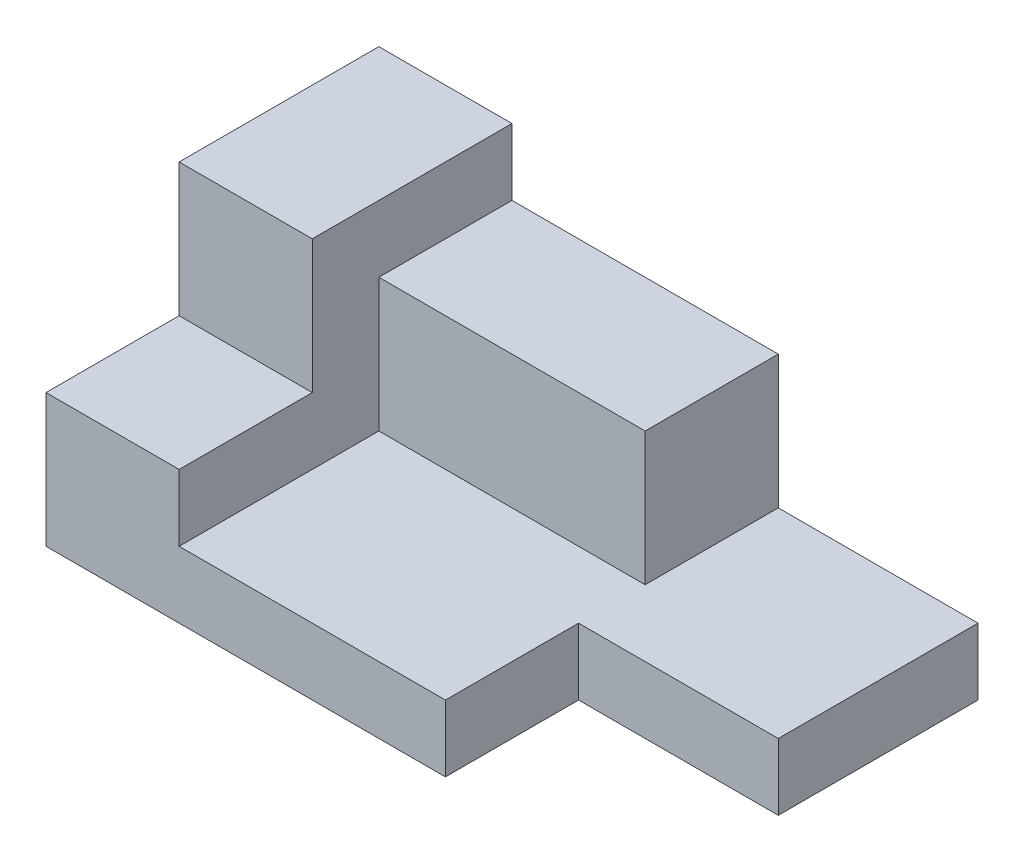
ISO-10303-21;
HEADER;
FILE_DESCRIPTION(('STEP AP214'),'2;1');
FILE_NAME('part.step','',(''),(''),'','','');
FILE_SCHEMA(('AUTOMOTIVE_DESIGN { 1 0 10303 214 1 1 1 1 }'));
ENDSEC;
DATA;
#1=APPLICATION_CONTEXT('core data for automotive mechanical design processes');
#2=APPLICATION_PROTOCOL_DEFINITION('international standard','automotive_design',2000,#1);
#3=PRODUCT_CONTEXT('',#1,'mechanical');
#4=PRODUCT('Part','Part','',(#3));
#5=PRODUCT_RELATED_PRODUCT_CATEGORY('part','',(#4));
#6=PRODUCT_DEFINITION_FORMATION('','',#4);
#7=PRODUCT_DEFINITION_CONTEXT('part definition',#1,'design');
#8=PRODUCT_DEFINITION('design','',#6,#7);
#9=PRODUCT_DEFINITION_SHAPE('','',#8);
#10=(LENGTH_UNIT() NAMED_UNIT(*) SI_UNIT(.MILLI.,.METRE.));
#11=(NAMED_UNIT(*) PLANE_ANGLE_UNIT() SI_UNIT($,.RADIAN.));
#12=(NAMED_UNIT(*) SI_UNIT($,.STERADIAN.) SOLID_ANGLE_UNIT());
#13=UNCERTAINTY_MEASURE_WITH_UNIT(LENGTH_MEASURE(1.E-05),#10,'distance_accuracy_value','');
#14=(GEOMETRIC_REPRESENTATION_CONTEXT(3) GLOBAL_UNCERTAINTY_ASSIGNED_CONTEXT((#13)) GLOBAL_UNIT_ASSIGNED_CONTEXT((#10,
#11,#12)) REPRESENTATION_CONTEXT('',''));
#15=CARTESIAN_POINT('',(0.,0.,0.));
#16=DIRECTION('',(0.,0.,1.));
#17=DIRECTION('',(1.,0.,0.));
#18=AXIS2_PLACEMENT_3D('',#15,#16,#17);
#19=CARTESIAN_POINT('',(0.,10.,0.));
#20=DIRECTION('',(0.,1.,0.));
#21=DIRECTION('',(0.,0.,1.));
#22=AXIS2_PLACEMENT_3D('',#19,#20,#21);
#23=PLANE('',#22);
#24=DIRECTION('',(0.,0.,-1.));
#25=VECTOR('',#24,1.);
#26=CARTESIAN_POINT('',(20.,10.,0.));
#27=LINE('',#26,#25);
#28=CARTESIAN_POINT('',(20.,10.,0.));
#29=VERTEX_POINT('',#28);
#30=CARTESIAN_POINT('',(20.,10.,-30.));
#31=VERTEX_POINT('',#30);
#32=EDGE_CURVE('E61',#29,#31,#27,.T.);
#33=ORIENTED_EDGE('',*,*,#32,.F.);
#34=DIRECTION('',(1.,0.,0.));
#35=VECTOR('',#34,1.);
#36=CARTESIAN_POINT('',(0.,10.,0.));
#37=LINE('',#36,#35);
#38=CARTESIAN_POINT('',(60.,10.,0.));
#39=VERTEX_POINT('',#38);
#40=EDGE_CURVE('E234',#29,#39,#37,.T.);
#41=ORIENTED_EDGE('',*,*,#40,.T.);
#42=DIRECTION('',(0.,0.,-1.));
#43=VECTOR('',#42,1.);
#44=CARTESIAN_POINT('',(60.,10.,0.));
#45=LINE('',#44,#43);
#46=CARTESIAN_POINT('',(60.,10.,-20.));
#47=VERTEX_POINT('',#46);
#48=EDGE_CURVE('E238',#39,#47,#45,.T.);
#49=ORIENTED_EDGE('',*,*,#48,.T.);
#50=DIRECTION('',(1.,0.,0.));
#51=VECTOR('',#50,1.);
#52=CARTESIAN_POINT('',(0.,10.,-20.));
#53=LINE('',#52,#51);
#54=CARTESIAN_POINT('',(90.,10.,-20.));
#55=VERTEX_POINT('',#54);
#56=EDGE_CURVE('E241',#47,#55,#53,.T.);
#57=ORIENTED_EDGE('',*,*,#56,.T.);
#58=DIRECTION('',(0.,0.,1.));
#59=VECTOR('',#58,1.);
#60=CARTESIAN_POINT('',(90.,10.,0.));
#61=LINE('',#60,#59);
#62=CARTESIAN_POINT('',(90.,10.,-50.));
#63=VERTEX_POINT('',#62);
#64=EDGE_CURVE('E244',#63,#55,#61,.T.);
#65=ORIENTED_EDGE('',*,*,#64,.F.);
#66=DIRECTION('',(1.,0.,0.));
#67=VECTOR('',#66,1.);
#68=CARTESIAN_POINT('',(0.,10.,-50.));
#69=LINE('',#68,#67);
#70=CARTESIAN_POINT('',(60.,10.,-50.));
#71=VERTEX_POINT('',#70);
#72=EDGE_CURVE('E231',#71,#63,#69,.T.);
#73=ORIENTED_EDGE('',*,*,#72,.F.);
#74=DIRECTION('',(0.,0.,1.));
#75=VECTOR('',#74,1.);
#76=CARTESIAN_POINT('',(60.,10.,0.));
#77=LINE('',#76,#75);
#78=CARTESIAN_POINT('',(60.,10.,-30.));
#79=VERTEX_POINT('',#78);
#80=EDGE_CURVE('E193',#71,#79,#77,.T.);
#81=ORIENTED_EDGE('',*,*,#80,.T.);
#82=DIRECTION('',(1.,0.,0.));
#83=VECTOR('',#82,1.);
#84=CARTESIAN_POINT('',(0.,10.,-30.));
#85=LINE('',#84,#83);
#86=EDGE_CURVE('E205',#31,#79,#85,.T.);
#87=ORIENTED_EDGE('',*,*,#86,.F.);
#88=EDGE_LOOP('',(#33,#41,#49,#57,#65,#73,#81,#87));
#89=FACE_BOUND('',#88,.T.);
#90=ADVANCED_FACE('F45',(#89),#23,.T.);
#91=CARTESIAN_POINT('',(0.,10.,-50.));
#92=DIRECTION('',(0.,0.,-1.));
#93=DIRECTION('',(-1.,0.,0.));
#94=AXIS2_PLACEMENT_3D('',#91,#92,#93);
#95=PLANE('',#94);
#96=DIRECTION('',(1.,0.,0.));
#97=VECTOR('',#96,1.);
#98=CARTESIAN_POINT('',(0.,0.,-50.));
#99=LINE('',#98,#97);
#100=CARTESIAN_POINT('',(0.,0.,-50.));
#101=VERTEX_POINT('',#100);
#102=CARTESIAN_POINT('',(90.,0.,-50.));
#103=VERTEX_POINT('',#102);
#104=EDGE_CURVE('E225',#101,#103,#99,.T.);
#105=ORIENTED_EDGE('',*,*,#104,.F.);
#106=DIRECTION('',(0.,-1.,0.));
#107=VECTOR('',#106,1.);
#108=CARTESIAN_POINT('',(0.,10.,-50.));
#109=LINE('',#108,#107);
#110=CARTESIAN_POINT('',(0.,40.,-50.));
#111=VERTEX_POINT('',#110);
#112=EDGE_CURVE('E11',#111,#101,#109,.T.);
#113=ORIENTED_EDGE('',*,*,#112,.F.);
#114=DIRECTION('',(-1.,0.,0.));
#115=VECTOR('',#114,1.);
#116=CARTESIAN_POINT('',(0.,40.,-50.));
#117=LINE('',#116,#115);
#118=CARTESIAN_POINT('',(20.,40.,-50.));
#119=VERTEX_POINT('',#118);
#120=EDGE_CURVE('E180',#119,#111,#117,.T.);
#121=ORIENTED_EDGE('',*,*,#120,.F.);
#122=DIRECTION('',(0.,-1.,0.));
#123=VECTOR('',#122,1.);
#124=CARTESIAN_POINT('',(20.,40.,-50.));
#125=LINE('',#124,#123);
#126=CARTESIAN_POINT('',(20.,30.,-50.));
#127=VERTEX_POINT('',#126);
#128=EDGE_CURVE('E194',#119,#127,#125,.T.);
#129=ORIENTED_EDGE('',*,*,#128,.T.);
#130=DIRECTION('',(-1.,0.,0.));
#131=VECTOR('',#130,1.);
#132=CARTESIAN_POINT('',(0.,30.,-50.));
#133=LINE('',#132,#131);
#134=CARTESIAN_POINT('',(60.,30.,-50.));
#135=VERTEX_POINT('',#134);
#136=EDGE_CURVE('E212',#135,#127,#133,.T.);
#137=ORIENTED_EDGE('',*,*,#136,.F.);
#138=DIRECTION('',(0.,-1.,0.));
#139=VECTOR('',#138,1.);
#140=CARTESIAN_POINT('',(60.,30.,-50.));
#141=LINE('',#140,#139);
#142=EDGE_CURVE('E222',#135,#71,#141,.T.);
#143=ORIENTED_EDGE('',*,*,#142,.T.);
#144=ORIENTED_EDGE('',*,*,#72,.T.);
#145=DIRECTION('',(0.,-1.,0.));
#146=VECTOR('',#145,1.);
#147=CARTESIAN_POINT('',(90.,10.,-50.));
#148=LINE('',#147,#146);
#149=EDGE_CURVE('E248',#63,#103,#148,.T.);
#150=ORIENTED_EDGE('',*,*,#149,.T.);
#151=EDGE_LOOP('',(#105,#113,#121,#129,#137,#143,#144,#150));
#152=FACE_BOUND('',#151,.T.);
#153=ADVANCED_FACE('F47',(#152),#95,.T.);
#154=CARTESIAN_POINT('',(0.,10.,0.));
#155=DIRECTION('',(-1.,0.,0.));
#156=DIRECTION('',(0.,0.,1.));
#157=AXIS2_PLACEMENT_3D('',#154,#155,#156);
#158=PLANE('',#157);
#159=DIRECTION('',(0.,0.,-1.));
#160=VECTOR('',#159,1.);
#161=CARTESIAN_POINT('',(0.,0.,0.));
#162=LINE('',#161,#160);
#163=CARTESIAN_POINT('',(0.,0.,0.));
#164=VERTEX_POINT('',#163);
#165=EDGE_CURVE('E146',#164,#101,#162,.T.);
#166=ORIENTED_EDGE('',*,*,#165,.F.);
#167=DIRECTION('',(0.,-1.,0.));
#168=VECTOR('',#167,1.);
#169=CARTESIAN_POINT('',(0.,10.,0.));
#170=LINE('',#169,#168);
#171=CARTESIAN_POINT('',(0.,20.,0.));
#172=VERTEX_POINT('',#171);
#173=EDGE_CURVE('E54',#172,#164,#170,.T.);
#174=ORIENTED_EDGE('',*,*,#173,.F.);
#175=DIRECTION('',(0.,0.,1.));
#176=VECTOR('',#175,1.);
#177=CARTESIAN_POINT('',(0.,20.,0.));
#178=LINE('',#177,#176);
#179=CARTESIAN_POINT('',(0.,20.,-20.));
#180=VERTEX_POINT('',#179);
#181=EDGE_CURVE('E144',#180,#172,#178,.T.);
#182=ORIENTED_EDGE('',*,*,#181,.F.);
#183=DIRECTION('',(0.,-1.,0.));
#184=VECTOR('',#183,1.);
#185=CARTESIAN_POINT('',(0.,40.,-20.));
#186=LINE('',#185,#184);
#187=CARTESIAN_POINT('',(0.,40.,-20.));
#188=VERTEX_POINT('',#187);
#189=EDGE_CURVE('E187',#188,#180,#186,.T.);
#190=ORIENTED_EDGE('',*,*,#189,.F.);
#191=DIRECTION('',(0.,0.,1.));
#192=VECTOR('',#191,1.);
#193=CARTESIAN_POINT('',(0.,40.,0.));
#194=LINE('',#193,#192);
#195=EDGE_CURVE('E177',#111,#188,#194,.T.);
#196=ORIENTED_EDGE('',*,*,#195,.F.);
#197=ORIENTED_EDGE('',*,*,#112,.T.);
#198=EDGE_LOOP('',(#166,#174,#182,#190,#196,#197));
#199=FACE_BOUND('',#198,.T.);
#200=ADVANCED_FACE('F142',(#199),#158,.T.);
#201=CARTESIAN_POINT('',(0.,10.,0.));
#202=DIRECTION('',(0.,0.,-1.));
#203=DIRECTION('',(-1.,0.,0.));
#204=AXIS2_PLACEMENT_3D('',#201,#202,#203);
#205=PLANE('',#204);
#206=DIRECTION('',(1.,0.,0.));
#207=VECTOR('',#206,1.);
#208=CARTESIAN_POINT('',(0.,0.,0.));
#209=LINE('',#208,#207);
#210=CARTESIAN_POINT('',(60.,0.,0.));
#211=VERTEX_POINT('',#210);
#212=EDGE_CURVE('E254',#164,#211,#209,.T.);
#213=ORIENTED_EDGE('',*,*,#212,.T.);
#214=DIRECTION('',(0.,-1.,0.));
#215=VECTOR('',#214,1.);
#216=CARTESIAN_POINT('',(60.,10.,0.));
#217=LINE('',#216,#215);
#218=EDGE_CURVE('E151',#39,#211,#217,.T.);
#219=ORIENTED_EDGE('',*,*,#218,.F.);
#220=ORIENTED_EDGE('',*,*,#40,.F.);
#221=DIRECTION('',(0.,-1.,0.));
#222=VECTOR('',#221,1.);
#223=CARTESIAN_POINT('',(20.,20.,0.));
#224=LINE('',#223,#222);
#225=CARTESIAN_POINT('',(20.,20.,0.));
#226=VERTEX_POINT('',#225);
#227=EDGE_CURVE('E161',#226,#29,#224,.T.);
#228=ORIENTED_EDGE('',*,*,#227,.F.);
#229=DIRECTION('',(-1.,0.,0.));
#230=VECTOR('',#229,1.);
#231=CARTESIAN_POINT('',(0.,20.,0.));
#232=LINE('',#231,#230);
#233=EDGE_CURVE('E156',#226,#172,#232,.T.);
#234=ORIENTED_EDGE('',*,*,#233,.T.);
#235=ORIENTED_EDGE('',*,*,#173,.T.);
#236=EDGE_LOOP('',(#213,#219,#220,#228,#234,#235));
#237=FACE_BOUND('',#236,.T.);
#238=ADVANCED_FACE('F159',(#237),#205,.F.);
#239=CARTESIAN_POINT('',(60.,10.,0.));
#240=DIRECTION('',(-1.,0.,0.));
#241=DIRECTION('',(0.,0.,1.));
#242=AXIS2_PLACEMENT_3D('',#239,#240,#241);
#243=PLANE('',#242);
#244=DIRECTION('',(0.,0.,-1.));
#245=VECTOR('',#244,1.);
#246=CARTESIAN_POINT('',(60.,0.,0.));
#247=LINE('',#246,#245);
#248=CARTESIAN_POINT('',(60.,0.,-20.));
#249=VERTEX_POINT('',#248);
#250=EDGE_CURVE('E257',#211,#249,#247,.T.);
#251=ORIENTED_EDGE('',*,*,#250,.T.);
#252=DIRECTION('',(0.,-1.,0.));
#253=VECTOR('',#252,1.);
#254=CARTESIAN_POINT('',(60.,10.,-20.));
#255=LINE('',#254,#253);
#256=EDGE_CURVE('E272',#47,#249,#255,.T.);
#257=ORIENTED_EDGE('',*,*,#256,.F.);
#258=ORIENTED_EDGE('',*,*,#48,.F.);
#259=ORIENTED_EDGE('',*,*,#218,.T.);
#260=EDGE_LOOP('',(#251,#257,#258,#259));
#261=FACE_BOUND('',#260,.T.);
#262=ADVANCED_FACE('F282',(#261),#243,.F.);
#263=CARTESIAN_POINT('',(0.,10.,-20.));
#264=DIRECTION('',(0.,0.,-1.));
#265=DIRECTION('',(-1.,0.,0.));
#266=AXIS2_PLACEMENT_3D('',#263,#264,#265);
#267=PLANE('',#266);
#268=DIRECTION('',(1.,0.,0.));
#269=VECTOR('',#268,1.);
#270=CARTESIAN_POINT('',(0.,0.,-20.));
#271=LINE('',#270,#269);
#272=CARTESIAN_POINT('',(90.,0.,-20.));
#273=VERTEX_POINT('',#272);
#274=EDGE_CURVE('E260',#249,#273,#271,.T.);
#275=ORIENTED_EDGE('',*,*,#274,.T.);
#276=DIRECTION('',(0.,-1.,0.));
#277=VECTOR('',#276,1.);
#278=CARTESIAN_POINT('',(90.,10.,-20.));
#279=LINE('',#278,#277);
#280=EDGE_CURVE('E269',#55,#273,#279,.T.);
#281=ORIENTED_EDGE('',*,*,#280,.F.);
#282=ORIENTED_EDGE('',*,*,#56,.F.);
#283=ORIENTED_EDGE('',*,*,#256,.T.);
#284=EDGE_LOOP('',(#275,#281,#282,#283));
#285=FACE_BOUND('',#284,.T.);
#286=ADVANCED_FACE('F290',(#285),#267,.F.);
#287=CARTESIAN_POINT('',(90.,10.,0.));
#288=DIRECTION('',(1.,0.,0.));
#289=DIRECTION('',(0.,0.,-1.));
#290=AXIS2_PLACEMENT_3D('',#287,#288,#289);
#291=PLANE('',#290);
#292=DIRECTION('',(0.,0.,1.));
#293=VECTOR('',#292,1.);
#294=CARTESIAN_POINT('',(90.,0.,0.));
#295=LINE('',#294,#293);
#296=EDGE_CURVE('E235',#103,#273,#295,.T.);
#297=ORIENTED_EDGE('',*,*,#296,.F.);
#298=ORIENTED_EDGE('',*,*,#149,.F.);
#299=ORIENTED_EDGE('',*,*,#64,.T.);
#300=ORIENTED_EDGE('',*,*,#280,.T.);
#301=EDGE_LOOP('',(#297,#298,#299,#300));
#302=FACE_BOUND('',#301,.T.);
#303=ADVANCED_FACE('F309',(#302),#291,.T.);
#304=CARTESIAN_POINT('',(0.,0.,0.));
#305=DIRECTION('',(0.,1.,0.));
#306=DIRECTION('',(0.,0.,1.));
#307=AXIS2_PLACEMENT_3D('',#304,#305,#306);
#308=PLANE('',#307);
#309=ORIENTED_EDGE('',*,*,#104,.T.);
#310=ORIENTED_EDGE('',*,*,#296,.T.);
#311=ORIENTED_EDGE('',*,*,#274,.F.);
#312=ORIENTED_EDGE('',*,*,#250,.F.);
#313=ORIENTED_EDGE('',*,*,#212,.F.);
#314=ORIENTED_EDGE('',*,*,#165,.T.);
#315=EDGE_LOOP('',(#309,#310,#311,#312,#313,#314));
#316=FACE_BOUND('',#315,.T.);
#317=ADVANCED_FACE('F286',(#316),#308,.F.);
#318=CARTESIAN_POINT('',(60.,30.,0.));
#319=DIRECTION('',(1.,0.,0.));
#320=DIRECTION('',(0.,0.,-1.));
#321=AXIS2_PLACEMENT_3D('',#318,#319,#320);
#322=PLANE('',#321);
#323=ORIENTED_EDGE('',*,*,#80,.F.);
#324=ORIENTED_EDGE('',*,*,#142,.F.);
#325=DIRECTION('',(0.,0.,1.));
#326=VECTOR('',#325,1.);
#327=CARTESIAN_POINT('',(60.,30.,0.));
#328=LINE('',#327,#326);
#329=CARTESIAN_POINT('',(60.,30.,-30.));
#330=VERTEX_POINT('',#329);
#331=EDGE_CURVE('E200',#135,#330,#328,.T.);
#332=ORIENTED_EDGE('',*,*,#331,.T.);
#333=DIRECTION('',(0.,-1.,0.));
#334=VECTOR('',#333,1.);
#335=CARTESIAN_POINT('',(60.,30.,-30.));
#336=LINE('',#335,#334);
#337=EDGE_CURVE('E215',#330,#79,#336,.T.);
#338=ORIENTED_EDGE('',*,*,#337,.T.);
#339=EDGE_LOOP('',(#323,#324,#332,#338));
#340=FACE_BOUND('',#339,.T.);
#341=ADVANCED_FACE('F316',(#340),#322,.T.);
#342=CARTESIAN_POINT('',(0.,30.,-30.));
#343=DIRECTION('',(0.,0.,-1.));
#344=DIRECTION('',(-1.,0.,0.));
#345=AXIS2_PLACEMENT_3D('',#342,#343,#344);
#346=PLANE('',#345);
#347=ORIENTED_EDGE('',*,*,#86,.T.);
#348=ORIENTED_EDGE('',*,*,#337,.F.);
#349=DIRECTION('',(1.,0.,0.));
#350=VECTOR('',#349,1.);
#351=CARTESIAN_POINT('',(0.,30.,-30.));
#352=LINE('',#351,#350);
#353=CARTESIAN_POINT('',(20.,30.,-30.));
#354=VERTEX_POINT('',#353);
#355=EDGE_CURVE('E204',#354,#330,#352,.T.);
#356=ORIENTED_EDGE('',*,*,#355,.F.);
#357=DIRECTION('',(0.,-1.,0.));
#358=VECTOR('',#357,1.);
#359=CARTESIAN_POINT('',(20.,30.,-30.));
#360=LINE('',#359,#358);
#361=EDGE_CURVE('E226',#354,#31,#360,.T.);
#362=ORIENTED_EDGE('',*,*,#361,.T.);
#363=EDGE_LOOP('',(#347,#348,#356,#362));
#364=FACE_BOUND('',#363,.T.);
#365=ADVANCED_FACE('F327',(#364),#346,.F.);
#366=CARTESIAN_POINT('',(0.,30.,0.));
#367=DIRECTION('',(0.,1.,0.));
#368=DIRECTION('',(0.,0.,1.));
#369=AXIS2_PLACEMENT_3D('',#366,#367,#368);
#370=PLANE('',#369);
#371=ORIENTED_EDGE('',*,*,#331,.F.);
#372=ORIENTED_EDGE('',*,*,#136,.T.);
#373=DIRECTION('',(0.,0.,-1.));
#374=VECTOR('',#373,1.);
#375=CARTESIAN_POINT('',(20.,30.,0.));
#376=LINE('',#375,#374);
#377=EDGE_CURVE('E208',#354,#127,#376,.T.);
#378=ORIENTED_EDGE('',*,*,#377,.F.);
#379=ORIENTED_EDGE('',*,*,#355,.T.);
#380=EDGE_LOOP('',(#371,#372,#378,#379));
#381=FACE_BOUND('',#380,.T.);
#382=ADVANCED_FACE('F331',(#381),#370,.T.);
#383=CARTESIAN_POINT('',(20.,40.,0.));
#384=DIRECTION('',(-1.,0.,0.));
#385=DIRECTION('',(0.,0.,1.));
#386=AXIS2_PLACEMENT_3D('',#383,#384,#385);
#387=PLANE('',#386);
#388=ORIENTED_EDGE('',*,*,#32,.T.);
#389=ORIENTED_EDGE('',*,*,#361,.F.);
#390=ORIENTED_EDGE('',*,*,#377,.T.);
#391=ORIENTED_EDGE('',*,*,#128,.F.);
#392=DIRECTION('',(0.,0.,-1.));
#393=VECTOR('',#392,1.);
#394=CARTESIAN_POINT('',(20.,40.,0.));
#395=LINE('',#394,#393);
#396=CARTESIAN_POINT('',(20.,40.,-20.));
#397=VERTEX_POINT('',#396);
#398=EDGE_CURVE('E184',#397,#119,#395,.T.);
#399=ORIENTED_EDGE('',*,*,#398,.F.);
#400=DIRECTION('',(0.,-1.,0.));
#401=VECTOR('',#400,1.);
#402=CARTESIAN_POINT('',(20.,40.,-20.));
#403=LINE('',#402,#401);
#404=CARTESIAN_POINT('',(20.,20.,-20.));
#405=VERTEX_POINT('',#404);
#406=EDGE_CURVE('E190',#397,#405,#403,.T.);
#407=ORIENTED_EDGE('',*,*,#406,.T.);
#408=DIRECTION('',(0.,0.,-1.));
#409=VECTOR('',#408,1.);
#410=CARTESIAN_POINT('',(20.,20.,0.));
#411=LINE('',#410,#409);
#412=EDGE_CURVE('E168',#226,#405,#411,.T.);
#413=ORIENTED_EDGE('',*,*,#412,.F.);
#414=ORIENTED_EDGE('',*,*,#227,.T.);
#415=EDGE_LOOP('',(#388,#389,#390,#391,#399,#407,#413,#414));
#416=FACE_BOUND('',#415,.T.);
#417=ADVANCED_FACE('F295',(#416),#387,.F.);
#418=CARTESIAN_POINT('',(0.,40.,-20.));
#419=DIRECTION('',(0.,0.,1.));
#420=DIRECTION('',(1.,0.,0.));
#421=AXIS2_PLACEMENT_3D('',#418,#419,#420);
#422=PLANE('',#421);
#423=DIRECTION('',(-1.,0.,0.));
#424=VECTOR('',#423,1.);
#425=CARTESIAN_POINT('',(0.,20.,-20.));
#426=LINE('',#425,#424);
#427=EDGE_CURVE('E69',#405,#180,#426,.T.);
#428=ORIENTED_EDGE('',*,*,#427,.F.);
#429=ORIENTED_EDGE('',*,*,#406,.F.);
#430=DIRECTION('',(-1.,0.,0.));
#431=VECTOR('',#430,1.);
#432=CARTESIAN_POINT('',(0.,40.,-20.));
#433=LINE('',#432,#431);
#434=EDGE_CURVE('E173',#397,#188,#433,.T.);
#435=ORIENTED_EDGE('',*,*,#434,.T.);
#436=ORIENTED_EDGE('',*,*,#189,.T.);
#437=EDGE_LOOP('',(#428,#429,#435,#436));
#438=FACE_BOUND('',#437,.T.);
#439=ADVANCED_FACE('F300',(#438),#422,.T.);
#440=CARTESIAN_POINT('',(0.,40.,0.));
#441=DIRECTION('',(0.,1.,0.));
#442=DIRECTION('',(0.,0.,1.));
#443=AXIS2_PLACEMENT_3D('',#440,#441,#442);
#444=PLANE('',#443);
#445=ORIENTED_EDGE('',*,*,#434,.F.);
#446=ORIENTED_EDGE('',*,*,#398,.T.);
#447=ORIENTED_EDGE('',*,*,#120,.T.);
#448=ORIENTED_EDGE('',*,*,#195,.T.);
#449=EDGE_LOOP('',(#445,#446,#447,#448));
#450=FACE_BOUND('',#449,.T.);
#451=ADVANCED_FACE('F302',(#450),#444,.T.);
#452=CARTESIAN_POINT('',(0.,20.,0.));
#453=DIRECTION('',(0.,1.,0.));
#454=DIRECTION('',(0.,0.,1.));
#455=AXIS2_PLACEMENT_3D('',#452,#453,#454);
#456=PLANE('',#455);
#457=ORIENTED_EDGE('',*,*,#233,.F.);
#458=ORIENTED_EDGE('',*,*,#412,.T.);
#459=ORIENTED_EDGE('',*,*,#427,.T.);
#460=ORIENTED_EDGE('',*,*,#181,.T.);
#461=EDGE_LOOP('',(#457,#458,#459,#460));
#462=FACE_BOUND('',#461,.T.);
#463=ADVANCED_FACE('F154',(#462),#456,.T.);
#464=CLOSED_SHELL('',(#90,#153,#200,#238,#262,#286,#303,#317,#341,#365,#382,#417,#439,#451,#463));
#465=MANIFOLD_SOLID_BREP('B2',#464);
#466=ADVANCED_BREP_SHAPE_REPRESENTATION('',(#18,#465),#14);
#467=SHAPE_DEFINITION_REPRESENTATION(#9,#466);
ENDSEC;
END-ISO-10303-21;
